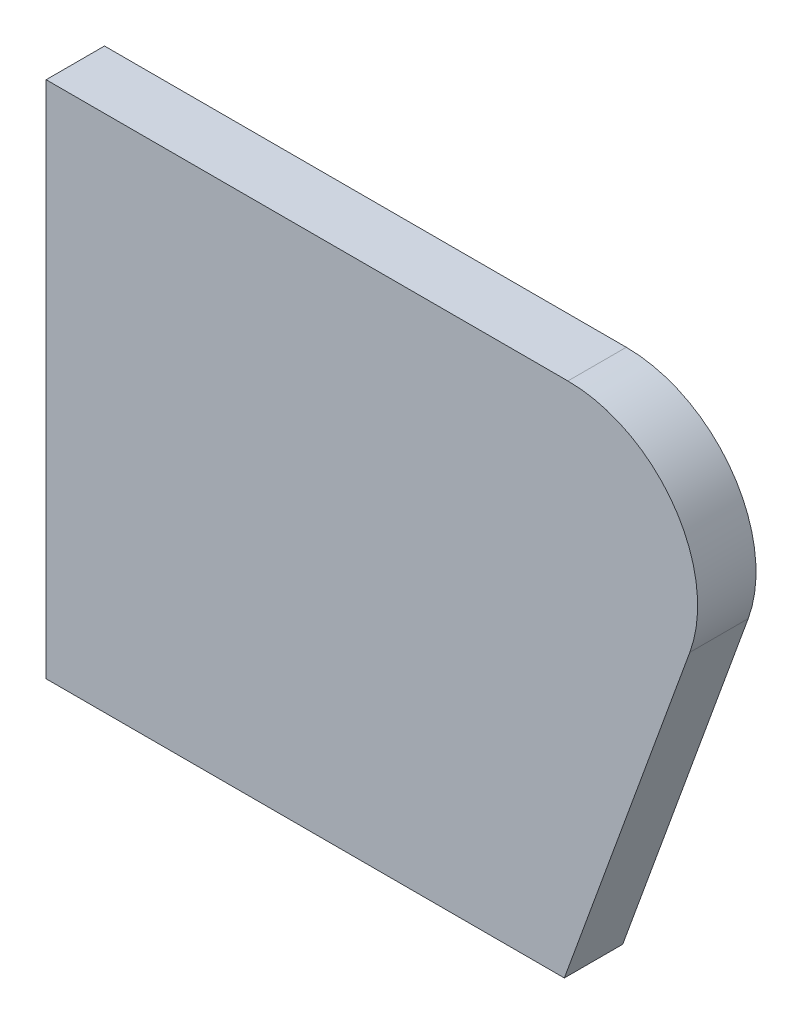
ISO-10303-21;
HEADER;
FILE_DESCRIPTION(('STEP AP214'),'2;1');
FILE_NAME('part.step','',(''),(''),'','','');
FILE_SCHEMA(('AUTOMOTIVE_DESIGN { 1 0 10303 214 1 1 1 1 }'));
ENDSEC;
DATA;
#1=APPLICATION_CONTEXT('core data for automotive mechanical design processes');
#2=APPLICATION_PROTOCOL_DEFINITION('international standard','automotive_design',2000,#1);
#3=PRODUCT_CONTEXT('',#1,'mechanical');
#4=PRODUCT('Part','Part','',(#3));
#5=PRODUCT_RELATED_PRODUCT_CATEGORY('part','',(#4));
#6=PRODUCT_DEFINITION_FORMATION('','',#4);
#7=PRODUCT_DEFINITION_CONTEXT('part definition',#1,'design');
#8=PRODUCT_DEFINITION('design','',#6,#7);
#9=PRODUCT_DEFINITION_SHAPE('','',#8);
#10=(LENGTH_UNIT() NAMED_UNIT(*) SI_UNIT(.MILLI.,.METRE.));
#11=(NAMED_UNIT(*) PLANE_ANGLE_UNIT() SI_UNIT($,.RADIAN.));
#12=(NAMED_UNIT(*) SI_UNIT($,.STERADIAN.) SOLID_ANGLE_UNIT());
#13=UNCERTAINTY_MEASURE_WITH_UNIT(LENGTH_MEASURE(1.E-05),#10,'distance_accuracy_value','');
#14=(GEOMETRIC_REPRESENTATION_CONTEXT(3) GLOBAL_UNCERTAINTY_ASSIGNED_CONTEXT((#13)) GLOBAL_UNIT_ASSIGNED_CONTEXT((#10,
#11,#12)) REPRESENTATION_CONTEXT('',''));
#15=CARTESIAN_POINT('',(0.,0.,0.));
#16=DIRECTION('',(0.,0.,1.));
#17=DIRECTION('',(1.,0.,0.));
#18=AXIS2_PLACEMENT_3D('',#15,#16,#17);
#19=CARTESIAN_POINT('',(-585.929666666667,1301.23951642609,180.));
#20=DIRECTION('',(0.,-1.,0.));
#21=DIRECTION('',(0.,0.,-1.));
#22=AXIS2_PLACEMENT_3D('',#19,#20,#21);
#23=PLANE('',#22);
#24=DIRECTION('',(-1.,0.,0.));
#25=VECTOR('',#24,1.);
#26=CARTESIAN_POINT('',(-585.929666666667,1301.23951642609,0.));
#27=LINE('',#26,#25);
#28=CARTESIAN_POINT('',(1023.14280044333,1301.23951642609,0.));
#29=VERTEX_POINT('',#28);
#30=CARTESIAN_POINT('',(-585.929666666667,1301.23951642609,0.));
#31=VERTEX_POINT('',#30);
#32=EDGE_CURVE('E108',#29,#31,#27,.T.);
#33=ORIENTED_EDGE('',*,*,#32,.T.);
#34=DIRECTION('',(0.,0.,-1.));
#35=VECTOR('',#34,1.);
#36=CARTESIAN_POINT('',(-585.929666666667,1301.23951642609,180.));
#37=LINE('',#36,#35);
#38=CARTESIAN_POINT('',(-585.929666666667,1301.23951642609,180.));
#39=VERTEX_POINT('',#38);
#40=EDGE_CURVE('E11',#39,#31,#37,.T.);
#41=ORIENTED_EDGE('',*,*,#40,.F.);
#42=DIRECTION('',(-1.,0.,0.));
#43=VECTOR('',#42,1.);
#44=CARTESIAN_POINT('',(-585.929666666667,1301.23951642609,180.));
#45=LINE('',#44,#43);
#46=CARTESIAN_POINT('',(1023.14280044333,1301.23951642609,180.));
#47=VERTEX_POINT('',#46);
#48=EDGE_CURVE('E116',#47,#39,#45,.T.);
#49=ORIENTED_EDGE('',*,*,#48,.F.);
#50=DIRECTION('',(0.,0.,-1.));
#51=VECTOR('',#50,1.);
#52=CARTESIAN_POINT('',(1023.14280044333,1301.23951642609,180.));
#53=LINE('',#52,#51);
#54=EDGE_CURVE('E104',#47,#29,#53,.T.);
#55=ORIENTED_EDGE('',*,*,#54,.T.);
#56=EDGE_LOOP('',(#33,#41,#49,#55));
#57=FACE_BOUND('',#56,.T.);
#58=ADVANCED_FACE('F34',(#57),#23,.F.);
#59=CARTESIAN_POINT('',(-585.929666666667,1301.23951642609,180.));
#60=DIRECTION('',(1.,0.,0.));
#61=DIRECTION('',(0.,1.,0.));
#62=AXIS2_PLACEMENT_3D('',#59,#60,#61);
#63=PLANE('',#62);
#64=DIRECTION('',(0.,-1.,0.));
#65=VECTOR('',#64,1.);
#66=CARTESIAN_POINT('',(-585.929666666667,1301.23951642609,0.));
#67=LINE('',#66,#65);
#68=CARTESIAN_POINT('',(-585.929666666667,-298.754652173913,0.));
#69=VERTEX_POINT('',#68);
#70=EDGE_CURVE('E111',#31,#69,#67,.T.);
#71=ORIENTED_EDGE('',*,*,#70,.T.);
#72=DIRECTION('',(0.,0.,-1.));
#73=VECTOR('',#72,1.);
#74=CARTESIAN_POINT('',(-585.929666666667,-298.754652173913,180.));
#75=LINE('',#74,#73);
#76=CARTESIAN_POINT('',(-585.929666666667,-298.754652173913,180.));
#77=VERTEX_POINT('',#76);
#78=EDGE_CURVE('E42',#77,#69,#75,.T.);
#79=ORIENTED_EDGE('',*,*,#78,.F.);
#80=DIRECTION('',(0.,-1.,0.));
#81=VECTOR('',#80,1.);
#82=CARTESIAN_POINT('',(-585.929666666667,1301.23951642609,180.));
#83=LINE('',#82,#81);
#84=EDGE_CURVE('E84',#39,#77,#83,.T.);
#85=ORIENTED_EDGE('',*,*,#84,.F.);
#86=ORIENTED_EDGE('',*,*,#40,.T.);
#87=EDGE_LOOP('',(#71,#79,#85,#86));
#88=FACE_BOUND('',#87,.T.);
#89=ADVANCED_FACE('F135',(#88),#63,.F.);
#90=CARTESIAN_POINT('',(-585.929666666667,-298.754652173913,180.));
#91=DIRECTION('',(0.,1.,0.));
#92=DIRECTION('',(0.,0.,1.));
#93=AXIS2_PLACEMENT_3D('',#90,#91,#92);
#94=PLANE('',#93);
#95=DIRECTION('',(1.,0.,0.));
#96=VECTOR('',#95,1.);
#97=CARTESIAN_POINT('',(-585.929666666667,-298.754652173913,0.));
#98=LINE('',#97,#96);
#99=CARTESIAN_POINT('',(1012.06033333333,-298.754652173913,0.));
#100=VERTEX_POINT('',#99);
#101=EDGE_CURVE('E99',#69,#100,#98,.T.);
#102=ORIENTED_EDGE('',*,*,#101,.T.);
#103=DIRECTION('',(0.,0.,-1.));
#104=VECTOR('',#103,1.);
#105=CARTESIAN_POINT('',(1012.06033333333,-298.754652173913,180.));
#106=LINE('',#105,#104);
#107=CARTESIAN_POINT('',(1012.06033333333,-298.754652173913,180.));
#108=VERTEX_POINT('',#107);
#109=EDGE_CURVE('E96',#108,#100,#106,.T.);
#110=ORIENTED_EDGE('',*,*,#109,.F.);
#111=DIRECTION('',(1.,0.,0.));
#112=VECTOR('',#111,1.);
#113=CARTESIAN_POINT('',(-585.929666666667,-298.754652173913,180.));
#114=LINE('',#113,#112);
#115=EDGE_CURVE('E88',#77,#108,#114,.T.);
#116=ORIENTED_EDGE('',*,*,#115,.F.);
#117=ORIENTED_EDGE('',*,*,#78,.T.);
#118=EDGE_LOOP('',(#102,#110,#116,#117));
#119=FACE_BOUND('',#118,.T.);
#120=ADVANCED_FACE('F97',(#119),#94,.F.);
#121=CARTESIAN_POINT('',(1012.06033333333,-298.754652173913,180.));
#122=DIRECTION('',(-0.93969262078591,0.342020143325665,0.));
#123=DIRECTION('',(-0.342020143325665,-0.93969262078591,0.));
#124=AXIS2_PLACEMENT_3D('',#121,#122,#123);
#125=PLANE('',#124);
#126=DIRECTION('',(0.342020143325665,0.93969262078591,0.));
#127=VECTOR('',#126,1.);
#128=CARTESIAN_POINT('',(1012.06033333333,-298.754652173913,0.));
#129=LINE('',#128,#127);
#130=CARTESIAN_POINT('',(1399.02840255742,764.431380069221,0.));
#131=VERTEX_POINT('',#130);
#132=EDGE_CURVE('E70',#100,#131,#129,.T.);
#133=ORIENTED_EDGE('',*,*,#132,.T.);
#134=DIRECTION('',(0.,0.,-1.));
#135=VECTOR('',#134,1.);
#136=CARTESIAN_POINT('',(1399.02840255742,764.431380069221,180.));
#137=LINE('',#136,#135);
#138=CARTESIAN_POINT('',(1399.02840255742,764.431380069221,180.));
#139=VERTEX_POINT('',#138);
#140=EDGE_CURVE('E100',#139,#131,#137,.T.);
#141=ORIENTED_EDGE('',*,*,#140,.F.);
#142=DIRECTION('',(0.342020143325665,0.93969262078591,0.));
#143=VECTOR('',#142,1.);
#144=CARTESIAN_POINT('',(1012.06033333333,-298.754652173913,180.));
#145=LINE('',#144,#143);
#146=EDGE_CURVE('E92',#108,#139,#145,.T.);
#147=ORIENTED_EDGE('',*,*,#146,.F.);
#148=ORIENTED_EDGE('',*,*,#109,.T.);
#149=EDGE_LOOP('',(#133,#141,#147,#148));
#150=FACE_BOUND('',#149,.T.);
#151=ADVANCED_FACE('F102',(#150),#125,.F.);
#152=CARTESIAN_POINT('',(1023.15138303989,901.239516518154,180.));
#153=DIRECTION('',(0.,0.,-1.));
#154=DIRECTION('',(-1.,0.,0.));
#155=AXIS2_PLACEMENT_3D('',#152,#153,#154);
#156=CYLINDRICAL_SURFACE('',#155,400.000000000009);
#157=CARTESIAN_POINT('',(1023.15138303989,901.239516518154,0.));
#158=DIRECTION('',(0.,0.,1.));
#159=DIRECTION('',(1.,0.,0.));
#160=AXIS2_PLACEMENT_3D('',#157,#158,#159);
#161=CIRCLE('',#160,400.000000000009);
#162=EDGE_CURVE('E76',#131,#29,#161,.T.);
#163=ORIENTED_EDGE('',*,*,#162,.T.);
#164=ORIENTED_EDGE('',*,*,#54,.F.);
#165=CARTESIAN_POINT('',(1023.15138303989,901.239516518154,180.));
#166=DIRECTION('',(0.,0.,1.));
#167=DIRECTION('',(1.,0.,0.));
#168=AXIS2_PLACEMENT_3D('',#165,#166,#167);
#169=CIRCLE('',#168,400.000000000009);
#170=EDGE_CURVE('E50',#139,#47,#169,.T.);
#171=ORIENTED_EDGE('',*,*,#170,.F.);
#172=ORIENTED_EDGE('',*,*,#140,.T.);
#173=EDGE_LOOP('',(#163,#164,#171,#172));
#174=FACE_BOUND('',#173,.T.);
#175=ADVANCED_FACE('F124',(#174),#156,.T.);
#176=CARTESIAN_POINT('',(1023.15138303989,901.239516518154,180.));
#177=DIRECTION('',(0.,0.,1.));
#178=DIRECTION('',(1.,0.,0.));
#179=AXIS2_PLACEMENT_3D('',#176,#177,#178);
#180=PLANE('',#179);
#181=ORIENTED_EDGE('',*,*,#48,.T.);
#182=ORIENTED_EDGE('',*,*,#84,.T.);
#183=ORIENTED_EDGE('',*,*,#115,.T.);
#184=ORIENTED_EDGE('',*,*,#146,.T.);
#185=ORIENTED_EDGE('',*,*,#170,.T.);
#186=EDGE_LOOP('',(#181,#182,#183,#184,#185));
#187=FACE_BOUND('',#186,.T.);
#188=ADVANCED_FACE('F90',(#187),#180,.T.);
#189=CARTESIAN_POINT('',(1023.15138303989,901.239516518154,0.));
#190=DIRECTION('',(0.,0.,1.));
#191=DIRECTION('',(1.,0.,0.));
#192=AXIS2_PLACEMENT_3D('',#189,#190,#191);
#193=PLANE('',#192);
#194=ORIENTED_EDGE('',*,*,#32,.F.);
#195=ORIENTED_EDGE('',*,*,#162,.F.);
#196=ORIENTED_EDGE('',*,*,#132,.F.);
#197=ORIENTED_EDGE('',*,*,#101,.F.);
#198=ORIENTED_EDGE('',*,*,#70,.F.);
#199=EDGE_LOOP('',(#194,#195,#196,#197,#198));
#200=FACE_BOUND('',#199,.T.);
#201=ADVANCED_FACE('F120',(#200),#193,.F.);
#202=CLOSED_SHELL('',(#58,#89,#120,#151,#175,#188,#201));
#203=MANIFOLD_SOLID_BREP('B2',#202);
#204=ADVANCED_BREP_SHAPE_REPRESENTATION('',(#18,#203),#14);
#205=SHAPE_DEFINITION_REPRESENTATION(#9,#204);
ENDSEC;
END-ISO-10303-21;
